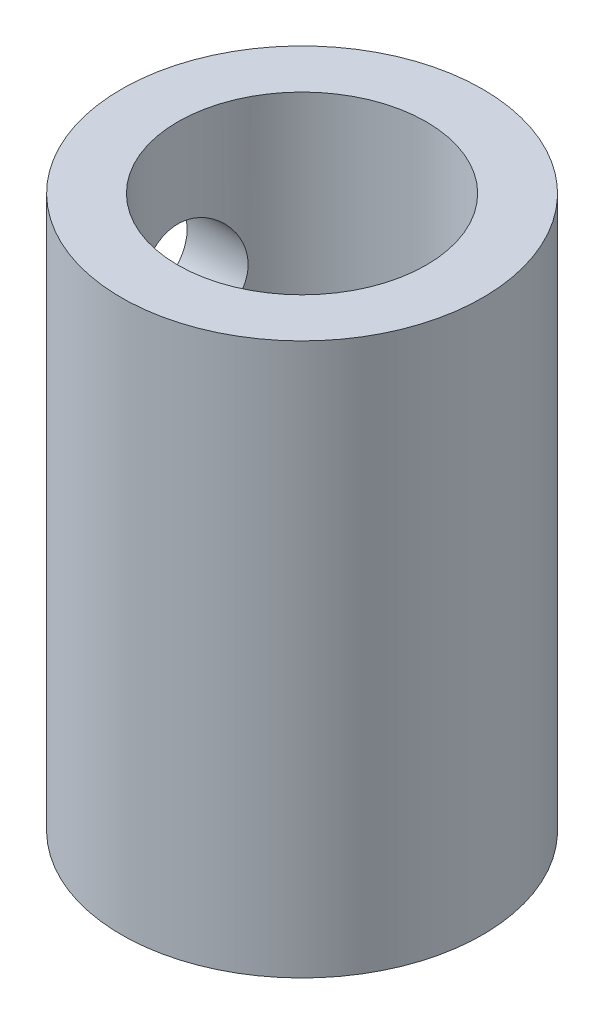
ISO-10303-21;
HEADER;
FILE_DESCRIPTION(('STEP AP214'),'2;1');
FILE_NAME('part.step','',(''),(''),'','','');
FILE_SCHEMA(('AUTOMOTIVE_DESIGN { 1 0 10303 214 1 1 1 1 }'));
ENDSEC;
DATA;
#1=APPLICATION_CONTEXT('core data for automotive mechanical design processes');
#2=APPLICATION_PROTOCOL_DEFINITION('international standard','automotive_design',2000,#1);
#3=PRODUCT_CONTEXT('',#1,'mechanical');
#4=PRODUCT('Part','Part','',(#3));
#5=PRODUCT_RELATED_PRODUCT_CATEGORY('part','',(#4));
#6=PRODUCT_DEFINITION_FORMATION('','',#4);
#7=PRODUCT_DEFINITION_CONTEXT('part definition',#1,'design');
#8=PRODUCT_DEFINITION('design','',#6,#7);
#9=PRODUCT_DEFINITION_SHAPE('','',#8);
#10=(LENGTH_UNIT() NAMED_UNIT(*) SI_UNIT(.MILLI.,.METRE.));
#11=(NAMED_UNIT(*) PLANE_ANGLE_UNIT() SI_UNIT($,.RADIAN.));
#12=(NAMED_UNIT(*) SI_UNIT($,.STERADIAN.) SOLID_ANGLE_UNIT());
#13=UNCERTAINTY_MEASURE_WITH_UNIT(LENGTH_MEASURE(1.E-05),#10,'distance_accuracy_value','');
#14=(GEOMETRIC_REPRESENTATION_CONTEXT(3) GLOBAL_UNCERTAINTY_ASSIGNED_CONTEXT((#13)) GLOBAL_UNIT_ASSIGNED_CONTEXT((#10,
#11,#12)) REPRESENTATION_CONTEXT('',''));
#15=CARTESIAN_POINT('',(0.,0.,0.));
#16=DIRECTION('',(0.,0.,1.));
#17=DIRECTION('',(1.,0.,0.));
#18=AXIS2_PLACEMENT_3D('',#15,#16,#17);
#19=CARTESIAN_POINT('',(2.955,4.,0.));
#20=DIRECTION('',(0.,-1.,0.));
#21=DIRECTION('',(0.,0.,-1.));
#22=AXIS2_PLACEMENT_3D('',#19,#20,#21);
#23=PLANE('',#22);
#24=CARTESIAN_POINT('',(0.,4.,0.));
#25=DIRECTION('',(0.,-1.,0.));
#26=DIRECTION('',(0.,0.,-1.));
#27=AXIS2_PLACEMENT_3D('',#24,#25,#26);
#28=CIRCLE('',#27,2.955);
#29=CARTESIAN_POINT('',(0.,4.,-2.955));
#30=VERTEX_POINT('',#29);
#31=EDGE_CURVE('E59',#30,#30,#28,.T.);
#32=ORIENTED_EDGE('',*,*,#31,.T.);
#33=EDGE_LOOP('',(#32));
#34=FACE_BOUND('',#33,.T.);
#35=CARTESIAN_POINT('',(0.,4.,0.));
#36=DIRECTION('',(0.,-1.,0.));
#37=DIRECTION('',(0.,0.,-1.));
#38=AXIS2_PLACEMENT_3D('',#35,#36,#37);
#39=CIRCLE('',#38,1.515);
#40=CARTESIAN_POINT('',(0.,4.,-1.515));
#41=VERTEX_POINT('',#40);
#42=EDGE_CURVE('E10',#41,#41,#39,.T.);
#43=ORIENTED_EDGE('',*,*,#42,.F.);
#44=EDGE_LOOP('',(#43));
#45=FACE_BOUND('',#44,.T.);
#46=ADVANCED_FACE('F31',(#34,#45),#23,.T.);
#47=CARTESIAN_POINT('',(0.,0.,0.));
#48=DIRECTION('',(0.,-1.,0.));
#49=DIRECTION('',(0.,0.,-1.));
#50=AXIS2_PLACEMENT_3D('',#47,#48,#49);
#51=CYLINDRICAL_SURFACE('',#50,1.515);
#52=ORIENTED_EDGE('',*,*,#42,.T.);
#53=EDGE_LOOP('',(#52));
#54=FACE_BOUND('',#53,.T.);
#55=CARTESIAN_POINT('',(0.,5.,0.));
#56=DIRECTION('',(0.,-1.,0.));
#57=DIRECTION('',(0.,0.,-1.));
#58=AXIS2_PLACEMENT_3D('',#55,#56,#57);
#59=CIRCLE('',#58,1.515);
#60=CARTESIAN_POINT('',(0.,5.,-1.515));
#61=VERTEX_POINT('',#60);
#62=EDGE_CURVE('E37',#61,#61,#59,.T.);
#63=ORIENTED_EDGE('',*,*,#62,.F.);
#64=EDGE_LOOP('',(#63));
#65=FACE_BOUND('',#64,.T.);
#66=ADVANCED_FACE('F107',(#54,#65),#51,.F.);
#67=CARTESIAN_POINT('',(1.515,5.,0.));
#68=DIRECTION('',(0.,-1.,0.));
#69=DIRECTION('',(0.,0.,-1.));
#70=AXIS2_PLACEMENT_3D('',#67,#68,#69);
#71=PLANE('',#70);
#72=ORIENTED_EDGE('',*,*,#62,.T.);
#73=EDGE_LOOP('',(#72));
#74=FACE_BOUND('',#73,.T.);
#75=ADVANCED_FACE('F112',(#74),#71,.T.);
#76=CARTESIAN_POINT('',(3.3,5.3,0.));
#77=DIRECTION('',(0.,1.,0.));
#78=DIRECTION('',(0.,0.,1.));
#79=AXIS2_PLACEMENT_3D('',#76,#77,#78);
#80=PLANE('',#79);
#81=CARTESIAN_POINT('',(0.,5.3,0.));
#82=DIRECTION('',(0.,-1.,0.));
#83=DIRECTION('',(0.,0.,-1.));
#84=AXIS2_PLACEMENT_3D('',#81,#82,#83);
#85=CIRCLE('',#84,3.3);
#86=CARTESIAN_POINT('',(0.,5.3,-3.3));
#87=VERTEX_POINT('',#86);
#88=EDGE_CURVE('E41',#87,#87,#85,.T.);
#89=ORIENTED_EDGE('',*,*,#88,.F.);
#90=EDGE_LOOP('',(#89));
#91=FACE_BOUND('',#90,.T.);
#92=ADVANCED_FACE('F103',(#91),#80,.T.);
#93=CARTESIAN_POINT('',(0.,0.,0.));
#94=DIRECTION('',(0.,-1.,0.));
#95=DIRECTION('',(0.,0.,-1.));
#96=AXIS2_PLACEMENT_3D('',#93,#94,#95);
#97=CYLINDRICAL_SURFACE('',#96,3.3);
#98=CARTESIAN_POINT('',(-2.93683077483194,10.8037469721204,-1.505));
#99=CARTESIAN_POINT('',(-2.93683559154862,10.8831878608749,-1.50499572827085));
#100=CARTESIAN_POINT('',(-2.94010136633761,10.9627519327014,-1.49866959369145));
#101=CARTESIAN_POINT('',(-2.95271735439451,11.1195184303656,-1.47365062336992));
#102=CARTESIAN_POINT('',(-2.96208248454173,11.1967145791608,-1.45492746699678));
#103=CARTESIAN_POINT('',(-2.98559746317474,11.3461920082511,-1.40603449051885));
#104=CARTESIAN_POINT('',(-2.99972513902486,11.4184942330508,-1.37591763720036));
#105=CARTESIAN_POINT('',(-3.03113964451882,11.5570019123539,-1.30525187936565));
#106=CARTESIAN_POINT('',(-3.04842615641048,11.6232079790727,-1.26470402395282));
#107=CARTESIAN_POINT('',(-3.08565479499145,11.7526372413593,-1.17108357149697));
#108=CARTESIAN_POINT('',(-3.10569757787781,11.8153511802631,-1.11734661892567));
#109=CARTESIAN_POINT('',(-3.14536087271771,11.931262151983,-1.0002624683367));
#110=CARTESIAN_POINT('',(-3.16498119872933,11.9844550665729,-0.936911133499112));
#111=CARTESIAN_POINT('',(-3.20285442088773,12.0825990851242,-0.798220796112142));
#112=CARTESIAN_POINT('',(-3.22097698772688,12.126952929493,-0.72242026571644));
#113=CARTESIAN_POINT('',(-3.25254799442364,12.2020526697832,-0.563454659431301));
#114=CARTESIAN_POINT('',(-3.26599889987188,12.2328057462133,-0.480293497478122));
#115=CARTESIAN_POINT('',(-3.28599238265705,12.2779090703835,-0.314337080325777));
#116=CARTESIAN_POINT('',(-3.29290577050313,12.2931441454707,-0.231827933637331));
#117=CARTESIAN_POINT('',(-3.30040910188874,12.3096629714332,-0.0651552408174957));
#118=CARTESIAN_POINT('',(-3.30100215951243,12.310953592872,0.0190074701065804));
#119=CARTESIAN_POINT('',(-3.29599746692272,12.2999559135362,0.180067575911771));
#120=CARTESIAN_POINT('',(-3.29084634792146,12.288647307764,0.257048583976608));
#121=CARTESIAN_POINT('',(-3.2755735950562,12.2544847045978,0.407879331873605));
#122=CARTESIAN_POINT('',(-3.26545159256075,12.231629850952,0.481728839038203));
#123=CARTESIAN_POINT('',(-3.24099916740408,12.1747927411945,0.625565100495589));
#124=CARTESIAN_POINT('',(-3.22660747093354,12.1406475799553,0.69547663479598));
#125=CARTESIAN_POINT('',(-3.19497353689312,12.0623814996191,0.828760015237238));
#126=CARTESIAN_POINT('',(-3.1777302554381,12.0182569251568,0.892129452650594));
#127=CARTESIAN_POINT('',(-3.14040526529177,11.917100860542,1.01606066959992));
#128=CARTESIAN_POINT('',(-3.12020674966605,11.8593078389616,1.07596645559546));
#129=CARTESIAN_POINT('',(-3.08023900354409,11.7345464780731,1.18555349220242));
#130=CARTESIAN_POINT('',(-3.06047001433269,11.6675731286335,1.2352291224418));
#131=CARTESIAN_POINT('',(-3.02266898306999,11.522541745321,1.32512732426655));
#132=CARTESIAN_POINT('',(-3.00475781391701,11.4441167248412,1.36481332643412));
#133=CARTESIAN_POINT('',(-2.97422590179899,11.2806714119155,1.43013814255881));
#134=CARTESIAN_POINT('',(-2.96160052858866,11.1956569693696,1.45578925685162));
#135=CARTESIAN_POINT('',(-2.9442908669614,11.0280298956781,1.49047079888406));
#136=CARTESIAN_POINT('',(-2.93909472594556,10.9456940460503,1.500576646887));
#137=CARTESIAN_POINT('',(-2.93576320128709,10.7803565419808,1.50708761791428));
#138=CARTESIAN_POINT('',(-2.93762443897596,10.6973552251142,1.50349929691667));
#139=CARTESIAN_POINT('',(-2.94766139127703,10.5403663319333,1.4837090765932));
#140=CARTESIAN_POINT('',(-2.95529824615735,10.4662038108934,1.46858268535905));
#141=CARTESIAN_POINT('',(-2.97528781172565,10.321563966804,1.42764745285516));
#142=CARTESIAN_POINT('',(-2.98764178350349,10.2510876349663,1.40183575478416));
#143=CARTESIAN_POINT('',(-3.01634871208642,10.1122150977215,1.33898528259544));
#144=CARTESIAN_POINT('',(-3.0328579816487,10.0440592489636,1.30148931469639));
#145=CARTESIAN_POINT('',(-3.06783173537768,9.91464270399493,1.21676106500635));
#146=CARTESIAN_POINT('',(-3.08629716295991,9.85338536444662,1.16952407482587));
#147=CARTESIAN_POINT('',(-3.12535088043589,9.73304400483754,1.06104943385154));
#148=CARTESIAN_POINT('',(-3.14596511128619,9.6748053018068,0.998879297428109));
#149=CARTESIAN_POINT('',(-3.18531527627769,9.56938346831369,0.865226025196206));
#150=CARTESIAN_POINT('',(-3.20405088039644,9.52220227840873,0.793741258120557));
#151=CARTESIAN_POINT('',(-3.23785246608675,9.43987695788671,0.642184185179804));
#152=CARTESIAN_POINT('',(-3.25287340062971,9.40487867257926,0.562021953191354));
#153=CARTESIAN_POINT('',(-3.27721496809872,9.34916926874978,0.396072993965806));
#154=CARTESIAN_POINT('',(-3.28653973726226,9.32844778181166,0.310290398162667));
#155=CARTESIAN_POINT('',(-3.29787877034136,9.30336665762391,0.143010142080822));
#156=CARTESIAN_POINT('',(-3.30042220436733,9.29782170255849,0.0617252466818475));
#157=CARTESIAN_POINT('',(-3.299463145505,9.29992364244158,-0.100627322826061));
#158=CARTESIAN_POINT('',(-3.2959621262862,9.30756732193134,-0.181695045056919));
#159=CARTESIAN_POINT('',(-3.28360804172904,9.33499079967721,-0.337217566446315));
#160=CARTESIAN_POINT('',(-3.27502256512612,9.35416451583734,-0.411802449214857));
#161=CARTESIAN_POINT('',(-3.25354112120656,9.40337437510956,-0.556627308344902));
#162=CARTESIAN_POINT('',(-3.24064442650405,9.43341235130256,-0.626866549141079));
#163=CARTESIAN_POINT('',(-3.2110155545291,9.50499588068308,-0.764569275191745));
#164=CARTESIAN_POINT('',(-3.19413503037863,9.54700459593667,-0.831759214665034));
#165=CARTESIAN_POINT('',(-3.15844054549352,9.6407132336312,-0.958431713656238));
#166=CARTESIAN_POINT('',(-3.13962573787806,9.69241740923635,-1.01791087119889));
#167=CARTESIAN_POINT('',(-3.10017208268264,9.80908604667547,-1.1326580565194));
#168=CARTESIAN_POINT('',(-3.07951179450407,9.87479613639159,-1.18716313782859));
#169=CARTESIAN_POINT('',(-3.04017538668058,10.0149460263544,-1.28456274008776));
#170=CARTESIAN_POINT('',(-3.02150059117025,10.0893915835784,-1.32744954189546));
#171=CARTESIAN_POINT('',(-2.98833922590932,10.2459880052032,-1.40052143075028));
#172=CARTESIAN_POINT('',(-2.97389008793972,10.3281996746281,-1.43059401621656));
#173=CARTESIAN_POINT('',(-2.95159963635427,10.4972911404429,-1.47604861572189));
#174=CARTESIAN_POINT('',(-2.94373615195582,10.584154218214,-1.49147994346663));
#175=CARTESIAN_POINT('',(-2.93881031466168,10.693652282454,-1.50113079537903));
#176=CARTESIAN_POINT('',(-2.93806974281529,10.7156365720057,-1.50258017998635));
#177=CARTESIAN_POINT('',(-2.93707929540719,10.7596597341226,-1.50451539289859));
#178=CARTESIAN_POINT('',(-2.93682943797983,10.7816986086749,-1.50500118559395));
#179=CARTESIAN_POINT('',(-2.93683077483194,10.8037469721204,-1.505));
#180=B_SPLINE_CURVE_WITH_KNOTS('',3,(#98,#99,#100,#101,#102,#103,#104,#105,#106,#107,#108,#109,
#110,#111,#112,#113,#114,#115,#116,#117,#118,#119,#120,#121,#122,#123,#124,#125,#126,#127,#128,
#129,#130,#131,#132,#133,#134,#135,#136,#137,#138,#139,#140,#141,#142,#143,#144,#145,#146,#147,
#148,#149,#150,#151,#152,#153,#154,#155,#156,#157,#158,#159,#160,#161,#162,#163,#164,#165,#166,
#167,#168,#169,#170,#171,#172,#173,#174,#175,#176,#177,#178,#179),.UNSPECIFIED.,.T.,.F.,(4,2,2,
2,2,2,2,2,2,2,2,2,2,2,2,2,2,2,2,2,2,2,2,2,2,2,2,2,2,2,2,2,2,2,2,2,2,2,2,2,4),(0.,
0.238229959790503,0.477044745307275,0.714762710367819,0.952456776162903,1.20631968063657,
1.46029212707054,1.7279262266198,1.99541885990761,2.24662219784324,2.49770175988501,
2.73054042488369,2.96339635937131,3.19977048188107,3.43623132664013,3.6920760395417,
3.94806093885407,4.2157593011611,4.48322267222976,4.73118603756638,4.97903070724472,
5.20623182847381,5.43349373298979,5.67109089628489,5.9088031741128,6.17053951352143,
6.43232175246256,6.69713800833464,6.96176174012037,7.20503308059235,7.44824511860746,
7.6796708069809,7.9111355610667,8.1531782494035,8.39532736547043,8.65763789837277,
8.92012228437758,9.18486589006141,9.44871460505903,9.51483152193887,9.58095088212494),.UNSPECIFIED.);
#181=CARTESIAN_POINT('',(-2.93683077483194,10.8037469721204,-1.505));
#182=VERTEX_POINT('',#181);
#183=EDGE_CURVE('E62',#182,#182,#180,.T.);
#184=ORIENTED_EDGE('',*,*,#183,.F.);
#185=EDGE_LOOP('',(#184));
#186=FACE_BOUND('',#185,.T.);
#187=ORIENTED_EDGE('',*,*,#88,.T.);
#188=EDGE_LOOP('',(#187));
#189=FACE_BOUND('',#188,.T.);
#190=CARTESIAN_POINT('',(0.,14.66,0.));
#191=DIRECTION('',(0.,-1.,0.));
#192=DIRECTION('',(0.,0.,-1.));
#193=AXIS2_PLACEMENT_3D('',#190,#191,#192);
#194=CIRCLE('',#193,3.3);
#195=CARTESIAN_POINT('',(0.,14.66,-3.3));
#196=VERTEX_POINT('',#195);
#197=EDGE_CURVE('E45',#196,#196,#194,.T.);
#198=ORIENTED_EDGE('',*,*,#197,.F.);
#199=EDGE_LOOP('',(#198));
#200=FACE_BOUND('',#199,.T.);
#201=ADVANCED_FACE('F75',(#186,#189,#200),#97,.F.);
#202=CARTESIAN_POINT('',(4.8,14.66,0.));
#203=DIRECTION('',(0.,1.,0.));
#204=DIRECTION('',(0.,0.,1.));
#205=AXIS2_PLACEMENT_3D('',#202,#203,#204);
#206=PLANE('',#205);
#207=ORIENTED_EDGE('',*,*,#197,.T.);
#208=EDGE_LOOP('',(#207));
#209=FACE_BOUND('',#208,.T.);
#210=CARTESIAN_POINT('',(0.,14.66,0.));
#211=DIRECTION('',(0.,-1.,0.));
#212=DIRECTION('',(0.,0.,-1.));
#213=AXIS2_PLACEMENT_3D('',#210,#211,#212);
#214=CIRCLE('',#213,4.8);
#215=CARTESIAN_POINT('',(0.,14.66,-4.8));
#216=VERTEX_POINT('',#215);
#217=EDGE_CURVE('E50',#216,#216,#214,.T.);
#218=ORIENTED_EDGE('',*,*,#217,.F.);
#219=EDGE_LOOP('',(#218));
#220=FACE_BOUND('',#219,.T.);
#221=ADVANCED_FACE('F96',(#209,#220),#206,.T.);
#222=CARTESIAN_POINT('',(0.,0.,0.));
#223=DIRECTION('',(0.,-1.,0.));
#224=DIRECTION('',(0.,0.,-1.));
#225=AXIS2_PLACEMENT_3D('',#222,#223,#224);
#226=CYLINDRICAL_SURFACE('',#225,4.8);
#227=CARTESIAN_POINT('',(-4.55795732757559,10.8037469721204,-1.505));
#228=CARTESIAN_POINT('',(-4.55795780214889,10.886021560479,-1.50499948577159));
#229=CARTESIAN_POINT('',(-4.56020937759085,10.9683014182059,-1.49823047949989));
#230=CARTESIAN_POINT('',(-4.56893225255866,11.130442877775,-1.4714114339046));
#231=CARTESIAN_POINT('',(-4.57540466996101,11.2103038331133,-1.45135787618774));
#232=CARTESIAN_POINT('',(-4.59176564278775,11.3652353217527,-1.39872782141411));
#233=CARTESIAN_POINT('',(-4.60164811896436,11.4403141001645,-1.36617359821712));
#234=CARTESIAN_POINT('',(-4.6237072384592,11.5839654569509,-1.28954071782126));
#235=CARTESIAN_POINT('',(-4.6358842920808,11.6525368684125,-1.24545999897218));
#236=CARTESIAN_POINT('',(-4.66163284034809,11.783598411754,-1.14539284307108));
#237=CARTESIAN_POINT('',(-4.67523608928019,11.8458303959664,-1.08907639191341));
#238=CARTESIAN_POINT('',(-4.70203417706954,11.9601397591525,-0.966842466053279));
#239=CARTESIAN_POINT('',(-4.71522895828306,12.0122157103343,-0.900923643668204));
#240=CARTESIAN_POINT('',(-4.74008685909584,12.1058754703954,-0.759499504161831));
#241=CARTESIAN_POINT('',(-4.7517082331901,12.1471932017171,-0.683809991904799));
#242=CARTESIAN_POINT('',(-4.77173893025475,12.2164113843935,-0.52612973056096));
#243=CARTESIAN_POINT('',(-4.78014901343079,12.2443150116611,-0.444140478332713));
#244=CARTESIAN_POINT('',(-4.7925847699272,12.285050314259,-0.278891224390635));
#245=CARTESIAN_POINT('',(-4.79673852450487,12.2983232565662,-0.195749813664984));
#246=CARTESIAN_POINT('',(-4.80064608055874,12.31081877768,-0.0283232667894009));
#247=CARTESIAN_POINT('',(-4.80040088870843,12.3100445710952,0.0559616032749295));
#248=CARTESIAN_POINT('',(-4.79562724499824,12.2947575484529,0.22017598213246));
#249=CARTESIAN_POINT('',(-4.79124794714995,12.2807231309383,0.300155055364916));
#250=CARTESIAN_POINT('',(-4.7788817849179,12.2400993371102,0.456559496227843));
#251=CARTESIAN_POINT('',(-4.77089468473511,12.2135091401699,0.532984631219583));
#252=CARTESIAN_POINT('',(-4.7520106334067,12.1482225846846,0.681212744115179));
#253=CARTESIAN_POINT('',(-4.74107913464892,12.1093814916889,0.75294739143123));
#254=CARTESIAN_POINT('',(-4.71745736981024,12.0208119597789,0.889029221709259));
#255=CARTESIAN_POINT('',(-4.70476665701458,11.9710807536882,0.953374520692255));
#256=CARTESIAN_POINT('',(-4.67834847733717,11.8596887286675,1.0757034292516));
#257=CARTESIAN_POINT('',(-4.66459985146863,11.7976150633885,1.13330705798156));
#258=CARTESIAN_POINT('',(-4.6380742091266,11.6645607068603,1.23740071068798));
#259=CARTESIAN_POINT('',(-4.62529730881727,11.5935789533802,1.28388940735826));
#260=CARTESIAN_POINT('',(-4.60205458275144,11.4436434198899,1.36487964076156));
#261=CARTESIAN_POINT('',(-4.59161656032137,11.364608480808,1.39923950210335));
#262=CARTESIAN_POINT('',(-4.57455934741354,11.2014681443055,1.4540426866046));
#263=CARTESIAN_POINT('',(-4.56793877411925,11.1173645951254,1.47449104948951));
#264=CARTESIAN_POINT('',(-4.5595733006883,10.9501169165355,1.50015574174395));
#265=CARTESIAN_POINT('',(-4.55764215642407,10.8670713948776,1.50595429791603));
#266=CARTESIAN_POINT('',(-4.55835693066869,10.7011879106112,1.50378998421753));
#267=CARTESIAN_POINT('',(-4.56100213614482,10.6183499176818,1.49582925815582));
#268=CARTESIAN_POINT('',(-4.57038759761603,10.4577464019472,1.46689282887001));
#269=CARTESIAN_POINT('',(-4.57700614279653,10.3799034006991,1.4463035697441));
#270=CARTESIAN_POINT('',(-4.59346334624996,10.228785936019,1.39314872900816));
#271=CARTESIAN_POINT('',(-4.60330253199955,10.1555122232873,1.36058118548601));
#272=CARTESIAN_POINT('',(-4.62544451385349,10.013275211021,1.2833229188902));
#273=CARTESIAN_POINT('',(-4.63781016028943,9.94449709464928,1.23830974033286));
#274=CARTESIAN_POINT('',(-4.66348204079049,9.81525860685213,1.13781386504363));
#275=CARTESIAN_POINT('',(-4.67678852024696,9.75480041766395,1.08232843055505));
#276=CARTESIAN_POINT('',(-4.70351519120008,9.64131313519917,0.959706887679089));
#277=CARTESIAN_POINT('',(-4.71691692369206,9.58869974490182,0.892180990611234));
#278=CARTESIAN_POINT('',(-4.74176906482858,9.49553427848734,0.748934292366146));
#279=CARTESIAN_POINT('',(-4.7532195620726,9.4549816546662,0.673213863532376));
#280=CARTESIAN_POINT('',(-4.77281415437015,9.38747732400832,0.516190219809477));
#281=CARTESIAN_POINT('',(-4.78098201314228,9.36042750862273,0.4349323002972));
#282=CARTESIAN_POINT('',(-4.7931954879819,9.32046861246774,0.268719023069997));
#283=CARTESIAN_POINT('',(-4.7972424034859,9.3075550740801,0.183764839695685));
#284=CARTESIAN_POINT('',(-4.80067133204292,9.29659934303415,0.0163959683069461));
#285=CARTESIAN_POINT('',(-4.80024164886021,9.29795687419862,-0.0659760319641054));
#286=CARTESIAN_POINT('',(-4.7952173084943,9.31405169999855,-0.229265221895276));
#287=CARTESIAN_POINT('',(-4.79062292595742,9.32878811234697,-0.310182507129554));
#288=CARTESIAN_POINT('',(-4.777845468647,9.37083933034825,-0.467257785621765));
#289=CARTESIAN_POINT('',(-4.7697085721639,9.39799249991633,-0.543463069091279));
#290=CARTESIAN_POINT('',(-4.7506851298919,9.46396028818129,-0.690272624229242));
#291=CARTESIAN_POINT('',(-4.73979811103095,9.50277691342682,-0.760875929504857));
#292=CARTESIAN_POINT('',(-4.71594811361123,9.59249918466465,-0.897095413299007));
#293=CARTESIAN_POINT('',(-4.70292703703452,9.64377169858054,-0.962459672656455));
#294=CARTESIAN_POINT('',(-4.67644360118781,9.75630439525637,-1.08385565872968));
#295=CARTESIAN_POINT('',(-4.662981110432,9.81756757597085,-1.1398845739028));
#296=CARTESIAN_POINT('',(-4.63660467371701,9.95079617513589,-1.2429095156366));
#297=CARTESIAN_POINT('',(-4.62372409326041,10.0230508237308,-1.28954111166817));
#298=CARTESIAN_POINT('',(-4.60054328676122,10.1747592205669,-1.36994968680304));
#299=CARTESIAN_POINT('',(-4.59024203481502,10.2542100894023,-1.40373177945935));
#300=CARTESIAN_POINT('',(-4.57421530248634,10.4112517437659,-1.45506635569789));
#301=CARTESIAN_POINT('',(-4.56818018913205,10.4884463704669,-1.47373617180992));
#302=CARTESIAN_POINT('',(-4.56005146663941,10.6450083871619,-1.49870169149698));
#303=CARTESIAN_POINT('',(-4.55795686974636,10.7243752275931,-1.50500049608521));
#304=CARTESIAN_POINT('',(-4.55795732757559,10.8037469721204,-1.505));
#305=B_SPLINE_CURVE_WITH_KNOTS('',3,(#227,#228,#229,#230,#231,#232,#233,#234,#235,#236,#237,
#238,#239,#240,#241,#242,#243,#244,#245,#246,#247,#248,#249,#250,#251,#252,#253,#254,#255,#256,
#257,#258,#259,#260,#261,#262,#263,#264,#265,#266,#267,#268,#269,#270,#271,#272,#273,#274,#275,
#276,#277,#278,#279,#280,#281,#282,#283,#284,#285,#286,#287,#288,#289,#290,#291,#292,#293,#294,
#295,#296,#297,#298,#299,#300,#301,#302,#303,#304),.UNSPECIFIED.,.T.,.F.,(4,2,2,2,2,2,2,2,2,2,2,
2,2,2,2,2,2,2,2,2,2,2,2,2,2,2,2,2,2,2,2,2,2,2,2,2,2,2,4),(0.,0.246530534573777,
0.493126388502968,0.739284878205225,0.985487426419692,1.23941093901711,1.49337012390801,
1.75311534522552,2.01279903914106,2.26441595609818,2.51597529271063,2.75879208586102,
3.00162475134746,3.24744110974571,3.49332000268087,3.74951085886867,4.00573229320611,
4.26485461726607,4.52388301889496,4.7724423307006,5.02096291842066,5.26223372694085,
5.50354407059437,5.75181170580982,6.00014433563808,6.25884795385844,6.51753982202497,
6.77432368907371,7.03102656064789,7.27697659903568,7.5229104191191,7.76573011437133,
8.0085916075933,8.25972872818649,8.51094134802089,8.77054896078073,9.03005315244822,
9.26794514085575,9.50577748980761),.UNSPECIFIED.);
#306=CARTESIAN_POINT('',(-4.55795732757559,10.8037469721204,-1.505));
#307=VERTEX_POINT('',#306);
#308=EDGE_CURVE('E70',#307,#307,#305,.T.);
#309=ORIENTED_EDGE('',*,*,#308,.T.);
#310=EDGE_LOOP('',(#309));
#311=FACE_BOUND('',#310,.T.);
#312=ORIENTED_EDGE('',*,*,#217,.T.);
#313=EDGE_LOOP('',(#312));
#314=FACE_BOUND('',#313,.T.);
#315=CARTESIAN_POINT('',(0.,0.,0.));
#316=DIRECTION('',(0.,-1.,0.));
#317=DIRECTION('',(0.,0.,-1.));
#318=AXIS2_PLACEMENT_3D('',#315,#316,#317);
#319=CIRCLE('',#318,4.8);
#320=CARTESIAN_POINT('',(0.,0.,-4.8));
#321=VERTEX_POINT('',#320);
#322=EDGE_CURVE('E53',#321,#321,#319,.T.);
#323=ORIENTED_EDGE('',*,*,#322,.F.);
#324=EDGE_LOOP('',(#323));
#325=FACE_BOUND('',#324,.T.);
#326=ADVANCED_FACE('F93',(#311,#314,#325),#226,.T.);
#327=CARTESIAN_POINT('',(2.955,0.,0.));
#328=DIRECTION('',(0.,-1.,0.));
#329=DIRECTION('',(0.,0.,-1.));
#330=AXIS2_PLACEMENT_3D('',#327,#328,#329);
#331=PLANE('',#330);
#332=ORIENTED_EDGE('',*,*,#322,.T.);
#333=EDGE_LOOP('',(#332));
#334=FACE_BOUND('',#333,.T.);
#335=CARTESIAN_POINT('',(0.,0.,0.));
#336=DIRECTION('',(0.,-1.,0.));
#337=DIRECTION('',(0.,0.,-1.));
#338=AXIS2_PLACEMENT_3D('',#335,#336,#337);
#339=CIRCLE('',#338,2.955);
#340=CARTESIAN_POINT('',(0.,0.,-2.955));
#341=VERTEX_POINT('',#340);
#342=EDGE_CURVE('E56',#341,#341,#339,.T.);
#343=ORIENTED_EDGE('',*,*,#342,.F.);
#344=EDGE_LOOP('',(#343));
#345=FACE_BOUND('',#344,.T.);
#346=ADVANCED_FACE('F89',(#334,#345),#331,.T.);
#347=CARTESIAN_POINT('',(0.,0.,0.));
#348=DIRECTION('',(0.,-1.,0.));
#349=DIRECTION('',(0.,0.,-1.));
#350=AXIS2_PLACEMENT_3D('',#347,#348,#349);
#351=CYLINDRICAL_SURFACE('',#350,2.955);
#352=ORIENTED_EDGE('',*,*,#342,.T.);
#353=EDGE_LOOP('',(#352));
#354=FACE_BOUND('',#353,.T.);
#355=ORIENTED_EDGE('',*,*,#31,.F.);
#356=EDGE_LOOP('',(#355));
#357=FACE_BOUND('',#356,.T.);
#358=ADVANCED_FACE('F82',(#354,#357),#351,.F.);
#359=CARTESIAN_POINT('',(-4.801,10.8037469721204,0.));
#360=DIRECTION('',(1.,0.,0.));
#361=DIRECTION('',(0.,0.,-1.));
#362=AXIS2_PLACEMENT_3D('',#359,#360,#361);
#363=CYLINDRICAL_SURFACE('',#362,1.505);
#364=ORIENTED_EDGE('',*,*,#183,.T.);
#365=EDGE_LOOP('',(#364));
#366=FACE_BOUND('',#365,.T.);
#367=ORIENTED_EDGE('',*,*,#308,.F.);
#368=EDGE_LOOP('',(#367));
#369=FACE_BOUND('',#368,.T.);
#370=ADVANCED_FACE('F79',(#366,#369),#363,.F.);
#371=CLOSED_SHELL('',(#46,#66,#75,#92,#201,#221,#326,#346,#358,#370));
#372=MANIFOLD_SOLID_BREP('B2',#371);
#373=ADVANCED_BREP_SHAPE_REPRESENTATION('',(#18,#372),#14);
#374=SHAPE_DEFINITION_REPRESENTATION(#9,#373);
ENDSEC;
END-ISO-10303-21;
